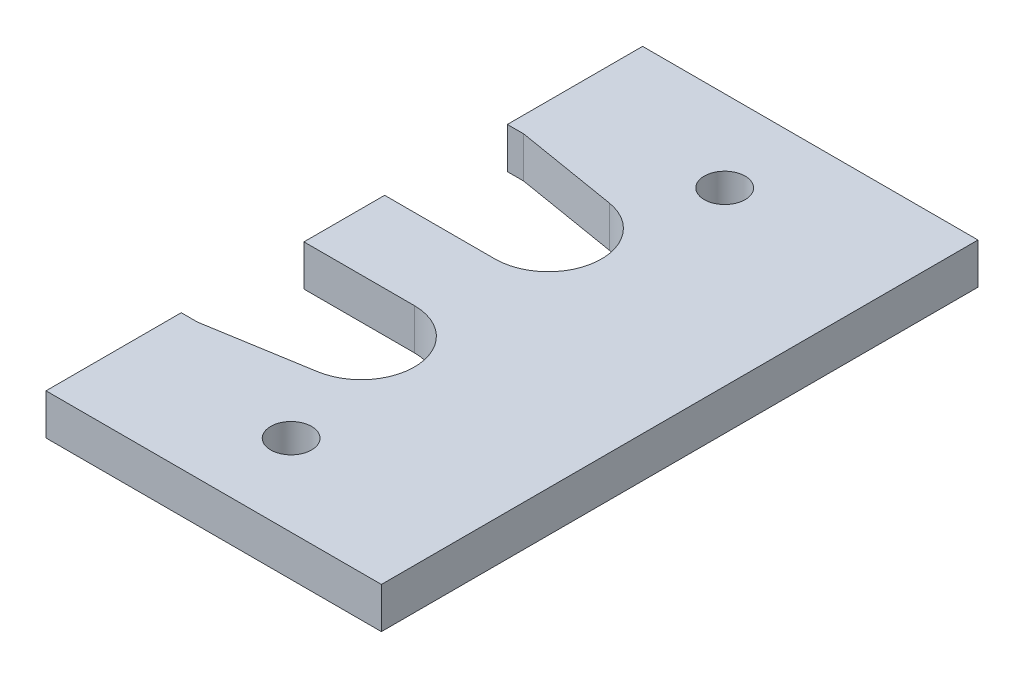
ISO-10303-21;
HEADER;
FILE_DESCRIPTION(('STEP AP214'),'2;1');
FILE_NAME('part.step','',(''),(''),'','','');
FILE_SCHEMA(('AUTOMOTIVE_DESIGN { 1 0 10303 214 1 1 1 1 }'));
ENDSEC;
DATA;
#1=APPLICATION_CONTEXT('core data for automotive mechanical design processes');
#2=APPLICATION_PROTOCOL_DEFINITION('international standard','automotive_design',2000,#1);
#3=PRODUCT_CONTEXT('',#1,'mechanical');
#4=PRODUCT('Part','Part','',(#3));
#5=PRODUCT_RELATED_PRODUCT_CATEGORY('part','',(#4));
#6=PRODUCT_DEFINITION_FORMATION('','',#4);
#7=PRODUCT_DEFINITION_CONTEXT('part definition',#1,'design');
#8=PRODUCT_DEFINITION('design','',#6,#7);
#9=PRODUCT_DEFINITION_SHAPE('','',#8);
#10=(LENGTH_UNIT() NAMED_UNIT(*) SI_UNIT(.MILLI.,.METRE.));
#11=(NAMED_UNIT(*) PLANE_ANGLE_UNIT() SI_UNIT($,.RADIAN.));
#12=(NAMED_UNIT(*) SI_UNIT($,.STERADIAN.) SOLID_ANGLE_UNIT());
#13=UNCERTAINTY_MEASURE_WITH_UNIT(LENGTH_MEASURE(1.E-05),#10,'distance_accuracy_value','');
#14=(GEOMETRIC_REPRESENTATION_CONTEXT(3) GLOBAL_UNCERTAINTY_ASSIGNED_CONTEXT((#13)) GLOBAL_UNIT_ASSIGNED_CONTEXT((#10,
#11,#12)) REPRESENTATION_CONTEXT('',''));
#15=CARTESIAN_POINT('',(0.,0.,0.));
#16=DIRECTION('',(0.,0.,1.));
#17=DIRECTION('',(1.,0.,0.));
#18=AXIS2_PLACEMENT_3D('',#15,#16,#17);
#19=CARTESIAN_POINT('',(8.20123472199718,5.,18.9136807914443));
#20=DIRECTION('',(0.,-1.,0.));
#21=DIRECTION('',(0.,0.,-1.));
#22=AXIS2_PLACEMENT_3D('',#19,#20,#21);
#23=PLANE('',#22);
#24=DIRECTION('',(-1.,0.,0.));
#25=VECTOR('',#24,1.);
#26=CARTESIAN_POINT('',(8.20123472199718,5.,2.55125735607543));
#27=LINE('',#26,#25);
#28=CARTESIAN_POINT('',(8.20123472199718,5.,2.55125735607543));
#29=VERTEX_POINT('',#28);
#30=CARTESIAN_POINT('',(-5.29876527800282,5.,2.55125735607543));
#31=VERTEX_POINT('',#30);
#32=EDGE_CURVE('E192',#29,#31,#27,.T.);
#33=ORIENTED_EDGE('',*,*,#32,.T.);
#34=DIRECTION('',(0.,0.,1.));
#35=VECTOR('',#34,1.);
#36=CARTESIAN_POINT('',(-5.29876527800282,5.,2.55125735607543));
#37=LINE('',#36,#35);
#38=CARTESIAN_POINT('',(-5.29876527800282,5.,12.4136807914443));
#39=VERTEX_POINT('',#38);
#40=EDGE_CURVE('E110',#31,#39,#37,.T.);
#41=ORIENTED_EDGE('',*,*,#40,.T.);
#42=DIRECTION('',(1.,0.,0.));
#43=VECTOR('',#42,1.);
#44=CARTESIAN_POINT('',(8.20123472199718,5.,12.4136807914443));
#45=LINE('',#44,#43);
#46=CARTESIAN_POINT('',(8.20123472199718,5.,12.4136807914443));
#47=VERTEX_POINT('',#46);
#48=EDGE_CURVE('E225',#39,#47,#45,.T.);
#49=ORIENTED_EDGE('',*,*,#48,.T.);
#50=CARTESIAN_POINT('',(8.20123472199718,5.,18.9136807914443));
#51=DIRECTION('',(0.,-1.,0.));
#52=DIRECTION('',(0.,0.,-1.));
#53=AXIS2_PLACEMENT_3D('',#50,#51,#52);
#54=CIRCLE('',#53,6.5);
#55=CARTESIAN_POINT('',(9.26668748951723,5.,25.3257639475008));
#56=VERTEX_POINT('',#55);
#57=EDGE_CURVE('E244',#47,#56,#54,.T.);
#58=ORIENTED_EDGE('',*,*,#57,.T.);
#59=DIRECTION('',(-0.986474331701005,0.,0.163915810387699));
#60=VECTOR('',#59,1.);
#61=CARTESIAN_POINT('',(-3.29876527800282,5.,27.4136807914443));
#62=LINE('',#61,#60);
#63=CARTESIAN_POINT('',(-3.29876527800282,5.,27.4136807914443));
#64=VERTEX_POINT('',#63);
#65=EDGE_CURVE('E241',#56,#64,#62,.T.);
#66=ORIENTED_EDGE('',*,*,#65,.T.);
#67=DIRECTION('',(-1.,0.,0.));
#68=VECTOR('',#67,1.);
#69=CARTESIAN_POINT('',(-5.29876527800282,5.,27.4136807914443));
#70=LINE('',#69,#68);
#71=CARTESIAN_POINT('',(-5.29876527800282,5.,27.4136807914443));
#72=VERTEX_POINT('',#71);
#73=EDGE_CURVE('E243',#64,#72,#70,.T.);
#74=ORIENTED_EDGE('',*,*,#73,.T.);
#75=DIRECTION('',(0.,0.,1.));
#76=VECTOR('',#75,1.);
#77=CARTESIAN_POINT('',(-5.29876527800282,5.,27.4136807914443));
#78=LINE('',#77,#76);
#79=CARTESIAN_POINT('',(-5.29876527800282,5.,43.9480749326021));
#80=VERTEX_POINT('',#79);
#81=EDGE_CURVE('E246',#72,#80,#78,.T.);
#82=ORIENTED_EDGE('',*,*,#81,.T.);
#83=DIRECTION('',(1.,0.,0.));
#84=VECTOR('',#83,1.);
#85=CARTESIAN_POINT('',(-5.29876527800282,5.,43.9480749326021));
#86=LINE('',#85,#84);
#87=CARTESIAN_POINT('',(35.7012347219972,5.,43.9480749326021));
#88=VERTEX_POINT('',#87);
#89=EDGE_CURVE('E252',#80,#88,#86,.T.);
#90=ORIENTED_EDGE('',*,*,#89,.T.);
#91=DIRECTION('',(0.,0.,-1.));
#92=VECTOR('',#91,1.);
#93=CARTESIAN_POINT('',(35.7012347219972,5.,-28.9831367850824));
#94=LINE('',#93,#92);
#95=CARTESIAN_POINT('',(35.7012347219972,5.,-28.9831367850824));
#96=VERTEX_POINT('',#95);
#97=EDGE_CURVE('E254',#88,#96,#94,.T.);
#98=ORIENTED_EDGE('',*,*,#97,.T.);
#99=DIRECTION('',(-1.,0.,0.));
#100=VECTOR('',#99,1.);
#101=CARTESIAN_POINT('',(-5.29876527800282,5.,-28.9831367850824));
#102=LINE('',#101,#100);
#103=CARTESIAN_POINT('',(-5.29876527800282,5.,-28.9831367850824));
#104=VERTEX_POINT('',#103);
#105=EDGE_CURVE('E256',#96,#104,#102,.T.);
#106=ORIENTED_EDGE('',*,*,#105,.T.);
#107=DIRECTION('',(0.,0.,1.));
#108=VECTOR('',#107,1.);
#109=CARTESIAN_POINT('',(-5.29876527800282,5.,-12.4487426439246));
#110=LINE('',#109,#108);
#111=CARTESIAN_POINT('',(-5.29876527800282,5.,-12.4487426439246));
#112=VERTEX_POINT('',#111);
#113=EDGE_CURVE('E147',#104,#112,#110,.T.);
#114=ORIENTED_EDGE('',*,*,#113,.T.);
#115=DIRECTION('',(1.,0.,0.));
#116=VECTOR('',#115,1.);
#117=CARTESIAN_POINT('',(-5.29876527800282,5.,-12.4487426439246));
#118=LINE('',#117,#116);
#119=CARTESIAN_POINT('',(-3.29876527800282,5.,-12.4487426439246));
#120=VERTEX_POINT('',#119);
#121=EDGE_CURVE('E141',#112,#120,#118,.T.);
#122=ORIENTED_EDGE('',*,*,#121,.T.);
#123=DIRECTION('',(0.986474331701005,0.,0.163915810387699));
#124=VECTOR('',#123,1.);
#125=CARTESIAN_POINT('',(-3.29876527800282,5.,-12.4487426439246));
#126=LINE('',#125,#124);
#127=CARTESIAN_POINT('',(9.26668748951723,5.,-10.3608257999811));
#128=VERTEX_POINT('',#127);
#129=EDGE_CURVE('E145',#120,#128,#126,.T.);
#130=ORIENTED_EDGE('',*,*,#129,.T.);
#131=CARTESIAN_POINT('',(8.20123472199718,5.,-3.94874264392457));
#132=DIRECTION('',(0.,-1.,0.));
#133=DIRECTION('',(0.,0.,1.));
#134=AXIS2_PLACEMENT_3D('',#131,#132,#133);
#135=CIRCLE('',#134,6.5);
#136=EDGE_CURVE('E49',#128,#29,#135,.T.);
#137=ORIENTED_EDGE('',*,*,#136,.T.);
#138=EDGE_LOOP('',(#33,#41,#49,#58,#66,#74,#82,#90,#98,#106,#114,#122,#130,#137));
#139=FACE_BOUND('',#138,.T.);
#140=CARTESIAN_POINT('',(14.7012347219972,5.,33.9824690737599));
#141=DIRECTION('',(0.,1.,0.));
#142=DIRECTION('',(0.,0.,-1.));
#143=AXIS2_PLACEMENT_3D('',#140,#141,#142);
#144=CIRCLE('',#143,2.5);
#145=CARTESIAN_POINT('',(14.7012347219972,5.,31.4824690737599));
#146=VERTEX_POINT('',#145);
#147=EDGE_CURVE('E169',#146,#146,#144,.T.);
#148=ORIENTED_EDGE('',*,*,#147,.F.);
#149=EDGE_LOOP('',(#148));
#150=FACE_BOUND('',#149,.T.);
#151=CARTESIAN_POINT('',(14.7012347219972,5.,-19.0175309262401));
#152=DIRECTION('',(0.,1.,0.));
#153=DIRECTION('',(0.,0.,1.));
#154=AXIS2_PLACEMENT_3D('',#151,#152,#153);
#155=CIRCLE('',#154,2.5);
#156=CARTESIAN_POINT('',(14.7012347219972,5.,-16.5175309262401));
#157=VERTEX_POINT('',#156);
#158=EDGE_CURVE('E297',#157,#157,#155,.T.);
#159=ORIENTED_EDGE('',*,*,#158,.F.);
#160=EDGE_LOOP('',(#159));
#161=FACE_BOUND('',#160,.T.);
#162=ADVANCED_FACE('F32',(#139,#150,#161),#23,.F.);
#163=CARTESIAN_POINT('',(8.20123472199718,0.,18.9136807914443));
#164=DIRECTION('',(0.,-1.,0.));
#165=DIRECTION('',(0.,0.,-1.));
#166=AXIS2_PLACEMENT_3D('',#163,#164,#165);
#167=PLANE('',#166);
#168=CARTESIAN_POINT('',(14.7012347219972,0.,33.9824690737599));
#169=DIRECTION('',(0.,1.,0.));
#170=DIRECTION('',(0.,0.,-1.));
#171=AXIS2_PLACEMENT_3D('',#168,#169,#170);
#172=CIRCLE('',#171,2.5);
#173=CARTESIAN_POINT('',(14.7012347219972,0.,31.4824690737599));
#174=VERTEX_POINT('',#173);
#175=EDGE_CURVE('E302',#174,#174,#172,.T.);
#176=ORIENTED_EDGE('',*,*,#175,.T.);
#177=EDGE_LOOP('',(#176));
#178=FACE_BOUND('',#177,.T.);
#179=DIRECTION('',(-1.,0.,0.));
#180=VECTOR('',#179,1.);
#181=CARTESIAN_POINT('',(8.20123472199718,0.,2.55125735607543));
#182=LINE('',#181,#180);
#183=CARTESIAN_POINT('',(8.20123472199718,0.,2.55125735607543));
#184=VERTEX_POINT('',#183);
#185=CARTESIAN_POINT('',(-5.29876527800282,0.,2.55125735607543));
#186=VERTEX_POINT('',#185);
#187=EDGE_CURVE('E165',#184,#186,#182,.T.);
#188=ORIENTED_EDGE('',*,*,#187,.F.);
#189=CARTESIAN_POINT('',(8.20123472199718,0.,-3.94874264392457));
#190=DIRECTION('',(0.,-1.,0.));
#191=DIRECTION('',(0.,0.,1.));
#192=AXIS2_PLACEMENT_3D('',#189,#190,#191);
#193=CIRCLE('',#192,6.5);
#194=CARTESIAN_POINT('',(9.26668748951723,0.,-10.3608257999811));
#195=VERTEX_POINT('',#194);
#196=EDGE_CURVE('E102',#195,#184,#193,.T.);
#197=ORIENTED_EDGE('',*,*,#196,.F.);
#198=DIRECTION('',(0.986474331701005,0.,0.163915810387699));
#199=VECTOR('',#198,1.);
#200=CARTESIAN_POINT('',(-3.29876527800282,0.,-12.4487426439246));
#201=LINE('',#200,#199);
#202=CARTESIAN_POINT('',(-3.29876527800282,0.,-12.4487426439246));
#203=VERTEX_POINT('',#202);
#204=EDGE_CURVE('E96',#203,#195,#201,.T.);
#205=ORIENTED_EDGE('',*,*,#204,.F.);
#206=DIRECTION('',(1.,0.,0.));
#207=VECTOR('',#206,1.);
#208=CARTESIAN_POINT('',(-5.29876527800282,0.,-12.4487426439246));
#209=LINE('',#208,#207);
#210=CARTESIAN_POINT('',(-5.29876527800282,0.,-12.4487426439246));
#211=VERTEX_POINT('',#210);
#212=EDGE_CURVE('E155',#211,#203,#209,.T.);
#213=ORIENTED_EDGE('',*,*,#212,.F.);
#214=DIRECTION('',(0.,0.,1.));
#215=VECTOR('',#214,1.);
#216=CARTESIAN_POINT('',(-5.29876527800282,0.,-12.4487426439246));
#217=LINE('',#216,#215);
#218=CARTESIAN_POINT('',(-5.29876527800282,0.,-28.9831367850824));
#219=VERTEX_POINT('',#218);
#220=EDGE_CURVE('E187',#219,#211,#217,.T.);
#221=ORIENTED_EDGE('',*,*,#220,.F.);
#222=DIRECTION('',(-1.,0.,0.));
#223=VECTOR('',#222,1.);
#224=CARTESIAN_POINT('',(-5.29876527800282,0.,-28.9831367850824));
#225=LINE('',#224,#223);
#226=CARTESIAN_POINT('',(35.7012347219972,0.,-28.9831367850824));
#227=VERTEX_POINT('',#226);
#228=EDGE_CURVE('E185',#227,#219,#225,.T.);
#229=ORIENTED_EDGE('',*,*,#228,.F.);
#230=DIRECTION('',(0.,0.,-1.));
#231=VECTOR('',#230,1.);
#232=CARTESIAN_POINT('',(35.7012347219972,0.,-28.9831367850824));
#233=LINE('',#232,#231);
#234=CARTESIAN_POINT('',(35.7012347219972,0.,43.9480749326021));
#235=VERTEX_POINT('',#234);
#236=EDGE_CURVE('E183',#235,#227,#233,.T.);
#237=ORIENTED_EDGE('',*,*,#236,.F.);
#238=DIRECTION('',(1.,0.,0.));
#239=VECTOR('',#238,1.);
#240=CARTESIAN_POINT('',(-5.29876527800282,0.,43.9480749326021));
#241=LINE('',#240,#239);
#242=CARTESIAN_POINT('',(-5.29876527800282,0.,43.9480749326021));
#243=VERTEX_POINT('',#242);
#244=EDGE_CURVE('E181',#243,#235,#241,.T.);
#245=ORIENTED_EDGE('',*,*,#244,.F.);
#246=DIRECTION('',(0.,0.,1.));
#247=VECTOR('',#246,1.);
#248=CARTESIAN_POINT('',(-5.29876527800282,0.,27.4136807914443));
#249=LINE('',#248,#247);
#250=CARTESIAN_POINT('',(-5.29876527800282,0.,27.4136807914443));
#251=VERTEX_POINT('',#250);
#252=EDGE_CURVE('E179',#251,#243,#249,.T.);
#253=ORIENTED_EDGE('',*,*,#252,.F.);
#254=DIRECTION('',(-1.,0.,0.));
#255=VECTOR('',#254,1.);
#256=CARTESIAN_POINT('',(-5.29876527800282,0.,27.4136807914443));
#257=LINE('',#256,#255);
#258=CARTESIAN_POINT('',(-3.29876527800282,0.,27.4136807914443));
#259=VERTEX_POINT('',#258);
#260=EDGE_CURVE('E177',#259,#251,#257,.T.);
#261=ORIENTED_EDGE('',*,*,#260,.F.);
#262=DIRECTION('',(-0.986474331701005,0.,0.163915810387699));
#263=VECTOR('',#262,1.);
#264=CARTESIAN_POINT('',(-3.29876527800282,0.,27.4136807914443));
#265=LINE('',#264,#263);
#266=CARTESIAN_POINT('',(9.26668748951723,0.,25.3257639475008));
#267=VERTEX_POINT('',#266);
#268=EDGE_CURVE('E175',#267,#259,#265,.T.);
#269=ORIENTED_EDGE('',*,*,#268,.F.);
#270=CARTESIAN_POINT('',(8.20123472199718,0.,18.9136807914443));
#271=DIRECTION('',(0.,-1.,0.));
#272=DIRECTION('',(0.,0.,-1.));
#273=AXIS2_PLACEMENT_3D('',#270,#271,#272);
#274=CIRCLE('',#273,6.5);
#275=CARTESIAN_POINT('',(8.20123472199718,0.,12.4136807914443));
#276=VERTEX_POINT('',#275);
#277=EDGE_CURVE('E173',#276,#267,#274,.T.);
#278=ORIENTED_EDGE('',*,*,#277,.F.);
#279=DIRECTION('',(1.,0.,0.));
#280=VECTOR('',#279,1.);
#281=CARTESIAN_POINT('',(8.20123472199718,0.,12.4136807914443));
#282=LINE('',#281,#280);
#283=CARTESIAN_POINT('',(-5.29876527800282,0.,12.4136807914443));
#284=VERTEX_POINT('',#283);
#285=EDGE_CURVE('E171',#284,#276,#282,.T.);
#286=ORIENTED_EDGE('',*,*,#285,.F.);
#287=DIRECTION('',(0.,0.,1.));
#288=VECTOR('',#287,1.);
#289=CARTESIAN_POINT('',(-5.29876527800282,0.,2.55125735607543));
#290=LINE('',#289,#288);
#291=EDGE_CURVE('E168',#186,#284,#290,.T.);
#292=ORIENTED_EDGE('',*,*,#291,.F.);
#293=EDGE_LOOP('',(#188,#197,#205,#213,#221,#229,#237,#245,#253,#261,#269,#278,#286,#292));
#294=FACE_BOUND('',#293,.T.);
#295=CARTESIAN_POINT('',(14.7012347219972,0.,-19.0175309262401));
#296=DIRECTION('',(0.,1.,0.));
#297=DIRECTION('',(0.,0.,1.));
#298=AXIS2_PLACEMENT_3D('',#295,#296,#297);
#299=CIRCLE('',#298,2.5);
#300=CARTESIAN_POINT('',(14.7012347219972,0.,-16.5175309262401));
#301=VERTEX_POINT('',#300);
#302=EDGE_CURVE('E300',#301,#301,#299,.T.);
#303=ORIENTED_EDGE('',*,*,#302,.T.);
#304=EDGE_LOOP('',(#303));
#305=FACE_BOUND('',#304,.T.);
#306=ADVANCED_FACE('F229',(#178,#294,#305),#167,.T.);
#307=CARTESIAN_POINT('',(8.20123472199718,5.,2.55125735607543));
#308=DIRECTION('',(0.,0.,1.));
#309=DIRECTION('',(1.,0.,0.));
#310=AXIS2_PLACEMENT_3D('',#307,#308,#309);
#311=PLANE('',#310);
#312=ORIENTED_EDGE('',*,*,#187,.T.);
#313=DIRECTION('',(0.,-1.,0.));
#314=VECTOR('',#313,1.);
#315=CARTESIAN_POINT('',(-5.29876527800282,5.,2.55125735607543));
#316=LINE('',#315,#314);
#317=EDGE_CURVE('E11',#31,#186,#316,.T.);
#318=ORIENTED_EDGE('',*,*,#317,.F.);
#319=ORIENTED_EDGE('',*,*,#32,.F.);
#320=DIRECTION('',(0.,-1.,0.));
#321=VECTOR('',#320,1.);
#322=CARTESIAN_POINT('',(8.20123472199718,5.,2.55125735607543));
#323=LINE('',#322,#321);
#324=EDGE_CURVE('E161',#29,#184,#323,.T.);
#325=ORIENTED_EDGE('',*,*,#324,.T.);
#326=EDGE_LOOP('',(#312,#318,#319,#325));
#327=FACE_BOUND('',#326,.T.);
#328=ADVANCED_FACE('F34',(#327),#311,.F.);
#329=CARTESIAN_POINT('',(-5.29876527800282,5.,2.55125735607543));
#330=DIRECTION('',(1.,0.,0.));
#331=DIRECTION('',(0.,0.,-1.));
#332=AXIS2_PLACEMENT_3D('',#329,#330,#331);
#333=PLANE('',#332);
#334=ORIENTED_EDGE('',*,*,#291,.T.);
#335=DIRECTION('',(0.,-1.,0.));
#336=VECTOR('',#335,1.);
#337=CARTESIAN_POINT('',(-5.29876527800282,5.,12.4136807914443));
#338=LINE('',#337,#336);
#339=EDGE_CURVE('E41',#39,#284,#338,.T.);
#340=ORIENTED_EDGE('',*,*,#339,.F.);
#341=ORIENTED_EDGE('',*,*,#40,.F.);
#342=ORIENTED_EDGE('',*,*,#317,.T.);
#343=EDGE_LOOP('',(#334,#340,#341,#342));
#344=FACE_BOUND('',#343,.T.);
#345=ADVANCED_FACE('F417',(#344),#333,.F.);
#346=CARTESIAN_POINT('',(8.20123472199718,5.,12.4136807914443));
#347=DIRECTION('',(0.,0.,-1.));
#348=DIRECTION('',(-1.,0.,0.));
#349=AXIS2_PLACEMENT_3D('',#346,#347,#348);
#350=PLANE('',#349);
#351=ORIENTED_EDGE('',*,*,#285,.T.);
#352=DIRECTION('',(0.,-1.,0.));
#353=VECTOR('',#352,1.);
#354=CARTESIAN_POINT('',(8.20123472199718,5.,12.4136807914443));
#355=LINE('',#354,#353);
#356=EDGE_CURVE('E217',#47,#276,#355,.T.);
#357=ORIENTED_EDGE('',*,*,#356,.F.);
#358=ORIENTED_EDGE('',*,*,#48,.F.);
#359=ORIENTED_EDGE('',*,*,#339,.T.);
#360=EDGE_LOOP('',(#351,#357,#358,#359));
#361=FACE_BOUND('',#360,.T.);
#362=ADVANCED_FACE('F223',(#361),#350,.F.);
#363=CARTESIAN_POINT('',(8.20123472199718,5.,18.9136807914443));
#364=DIRECTION('',(0.,-1.,0.));
#365=DIRECTION('',(0.,0.,-1.));
#366=AXIS2_PLACEMENT_3D('',#363,#364,#365);
#367=CYLINDRICAL_SURFACE('',#366,6.5);
#368=ORIENTED_EDGE('',*,*,#277,.T.);
#369=DIRECTION('',(0.,-1.,0.));
#370=VECTOR('',#369,1.);
#371=CARTESIAN_POINT('',(9.26668748951723,5.,25.3257639475008));
#372=LINE('',#371,#370);
#373=EDGE_CURVE('E214',#56,#267,#372,.T.);
#374=ORIENTED_EDGE('',*,*,#373,.F.);
#375=ORIENTED_EDGE('',*,*,#57,.F.);
#376=ORIENTED_EDGE('',*,*,#356,.T.);
#377=EDGE_LOOP('',(#368,#374,#375,#376));
#378=FACE_BOUND('',#377,.T.);
#379=ADVANCED_FACE('F235',(#378),#367,.F.);
#380=CARTESIAN_POINT('',(-3.29876527800282,5.,27.4136807914443));
#381=DIRECTION('',(0.163915810387699,0.,0.986474331701005));
#382=DIRECTION('',(0.986474331701005,0.,-0.163915810387699));
#383=AXIS2_PLACEMENT_3D('',#380,#381,#382);
#384=PLANE('',#383);
#385=ORIENTED_EDGE('',*,*,#268,.T.);
#386=DIRECTION('',(0.,-1.,0.));
#387=VECTOR('',#386,1.);
#388=CARTESIAN_POINT('',(-3.29876527800282,5.,27.4136807914443));
#389=LINE('',#388,#387);
#390=EDGE_CURVE('E211',#64,#259,#389,.T.);
#391=ORIENTED_EDGE('',*,*,#390,.F.);
#392=ORIENTED_EDGE('',*,*,#65,.F.);
#393=ORIENTED_EDGE('',*,*,#373,.T.);
#394=EDGE_LOOP('',(#385,#391,#392,#393));
#395=FACE_BOUND('',#394,.T.);
#396=ADVANCED_FACE('F239',(#395),#384,.F.);
#397=CARTESIAN_POINT('',(-5.29876527800282,5.,27.4136807914443));
#398=DIRECTION('',(0.,0.,1.));
#399=DIRECTION('',(1.,0.,0.));
#400=AXIS2_PLACEMENT_3D('',#397,#398,#399);
#401=PLANE('',#400);
#402=ORIENTED_EDGE('',*,*,#260,.T.);
#403=DIRECTION('',(0.,-1.,0.));
#404=VECTOR('',#403,1.);
#405=CARTESIAN_POINT('',(-5.29876527800282,5.,27.4136807914443));
#406=LINE('',#405,#404);
#407=EDGE_CURVE('E208',#72,#251,#406,.T.);
#408=ORIENTED_EDGE('',*,*,#407,.F.);
#409=ORIENTED_EDGE('',*,*,#73,.F.);
#410=ORIENTED_EDGE('',*,*,#390,.T.);
#411=EDGE_LOOP('',(#402,#408,#409,#410));
#412=FACE_BOUND('',#411,.T.);
#413=ADVANCED_FACE('F382',(#412),#401,.F.);
#414=CARTESIAN_POINT('',(-5.29876527800282,5.,27.4136807914443));
#415=DIRECTION('',(1.,0.,0.));
#416=DIRECTION('',(0.,0.,-1.));
#417=AXIS2_PLACEMENT_3D('',#414,#415,#416);
#418=PLANE('',#417);
#419=ORIENTED_EDGE('',*,*,#252,.T.);
#420=DIRECTION('',(0.,-1.,0.));
#421=VECTOR('',#420,1.);
#422=CARTESIAN_POINT('',(-5.29876527800282,5.,43.9480749326021));
#423=LINE('',#422,#421);
#424=EDGE_CURVE('E205',#80,#243,#423,.T.);
#425=ORIENTED_EDGE('',*,*,#424,.F.);
#426=ORIENTED_EDGE('',*,*,#81,.F.);
#427=ORIENTED_EDGE('',*,*,#407,.T.);
#428=EDGE_LOOP('',(#419,#425,#426,#427));
#429=FACE_BOUND('',#428,.T.);
#430=ADVANCED_FACE('F372',(#429),#418,.F.);
#431=CARTESIAN_POINT('',(-5.29876527800282,5.,43.9480749326021));
#432=DIRECTION('',(0.,0.,-1.));
#433=DIRECTION('',(-1.,0.,0.));
#434=AXIS2_PLACEMENT_3D('',#431,#432,#433);
#435=PLANE('',#434);
#436=ORIENTED_EDGE('',*,*,#244,.T.);
#437=DIRECTION('',(0.,-1.,0.));
#438=VECTOR('',#437,1.);
#439=CARTESIAN_POINT('',(35.7012347219972,5.,43.9480749326021));
#440=LINE('',#439,#438);
#441=EDGE_CURVE('E202',#88,#235,#440,.T.);
#442=ORIENTED_EDGE('',*,*,#441,.F.);
#443=ORIENTED_EDGE('',*,*,#89,.F.);
#444=ORIENTED_EDGE('',*,*,#424,.T.);
#445=EDGE_LOOP('',(#436,#442,#443,#444));
#446=FACE_BOUND('',#445,.T.);
#447=ADVANCED_FACE('F362',(#446),#435,.F.);
#448=CARTESIAN_POINT('',(35.7012347219972,5.,-28.9831367850824));
#449=DIRECTION('',(-1.,0.,0.));
#450=DIRECTION('',(0.,0.,1.));
#451=AXIS2_PLACEMENT_3D('',#448,#449,#450);
#452=PLANE('',#451);
#453=ORIENTED_EDGE('',*,*,#236,.T.);
#454=DIRECTION('',(0.,-1.,0.));
#455=VECTOR('',#454,1.);
#456=CARTESIAN_POINT('',(35.7012347219972,5.,-28.9831367850824));
#457=LINE('',#456,#455);
#458=EDGE_CURVE('E199',#96,#227,#457,.T.);
#459=ORIENTED_EDGE('',*,*,#458,.F.);
#460=ORIENTED_EDGE('',*,*,#97,.F.);
#461=ORIENTED_EDGE('',*,*,#441,.T.);
#462=EDGE_LOOP('',(#453,#459,#460,#461));
#463=FACE_BOUND('',#462,.T.);
#464=ADVANCED_FACE('F353',(#463),#452,.F.);
#465=CARTESIAN_POINT('',(-5.29876527800282,5.,-28.9831367850824));
#466=DIRECTION('',(0.,0.,1.));
#467=DIRECTION('',(1.,0.,0.));
#468=AXIS2_PLACEMENT_3D('',#465,#466,#467);
#469=PLANE('',#468);
#470=ORIENTED_EDGE('',*,*,#228,.T.);
#471=DIRECTION('',(0.,-1.,0.));
#472=VECTOR('',#471,1.);
#473=CARTESIAN_POINT('',(-5.29876527800282,5.,-28.9831367850824));
#474=LINE('',#473,#472);
#475=EDGE_CURVE('E196',#104,#219,#474,.T.);
#476=ORIENTED_EDGE('',*,*,#475,.F.);
#477=ORIENTED_EDGE('',*,*,#105,.F.);
#478=ORIENTED_EDGE('',*,*,#458,.T.);
#479=EDGE_LOOP('',(#470,#476,#477,#478));
#480=FACE_BOUND('',#479,.T.);
#481=ADVANCED_FACE('F262',(#480),#469,.F.);
#482=CARTESIAN_POINT('',(-5.29876527800282,5.,-12.4487426439246));
#483=DIRECTION('',(1.,0.,0.));
#484=DIRECTION('',(0.,0.,-1.));
#485=AXIS2_PLACEMENT_3D('',#482,#483,#484);
#486=PLANE('',#485);
#487=ORIENTED_EDGE('',*,*,#220,.T.);
#488=DIRECTION('',(0.,-1.,0.));
#489=VECTOR('',#488,1.);
#490=CARTESIAN_POINT('',(-5.29876527800282,5.,-12.4487426439246));
#491=LINE('',#490,#489);
#492=EDGE_CURVE('E156',#112,#211,#491,.T.);
#493=ORIENTED_EDGE('',*,*,#492,.F.);
#494=ORIENTED_EDGE('',*,*,#113,.F.);
#495=ORIENTED_EDGE('',*,*,#475,.T.);
#496=EDGE_LOOP('',(#487,#493,#494,#495));
#497=FACE_BOUND('',#496,.T.);
#498=ADVANCED_FACE('F266',(#497),#486,.F.);
#499=CARTESIAN_POINT('',(-5.29876527800282,5.,-12.4487426439246));
#500=DIRECTION('',(0.,0.,-1.));
#501=DIRECTION('',(-1.,0.,0.));
#502=AXIS2_PLACEMENT_3D('',#499,#500,#501);
#503=PLANE('',#502);
#504=ORIENTED_EDGE('',*,*,#212,.T.);
#505=DIRECTION('',(0.,-1.,0.));
#506=VECTOR('',#505,1.);
#507=CARTESIAN_POINT('',(-3.29876527800282,5.,-12.4487426439246));
#508=LINE('',#507,#506);
#509=EDGE_CURVE('E152',#120,#203,#508,.T.);
#510=ORIENTED_EDGE('',*,*,#509,.F.);
#511=ORIENTED_EDGE('',*,*,#121,.F.);
#512=ORIENTED_EDGE('',*,*,#492,.T.);
#513=EDGE_LOOP('',(#504,#510,#511,#512));
#514=FACE_BOUND('',#513,.T.);
#515=ADVANCED_FACE('F153',(#514),#503,.F.);
#516=CARTESIAN_POINT('',(-3.29876527800282,5.,-12.4487426439246));
#517=DIRECTION('',(0.163915810387699,0.,-0.986474331701005));
#518=DIRECTION('',(-0.986474331701005,0.,-0.163915810387699));
#519=AXIS2_PLACEMENT_3D('',#516,#517,#518);
#520=PLANE('',#519);
#521=ORIENTED_EDGE('',*,*,#204,.T.);
#522=DIRECTION('',(0.,-1.,0.));
#523=VECTOR('',#522,1.);
#524=CARTESIAN_POINT('',(9.26668748951723,5.,-10.3608257999811));
#525=LINE('',#524,#523);
#526=EDGE_CURVE('E157',#128,#195,#525,.T.);
#527=ORIENTED_EDGE('',*,*,#526,.F.);
#528=ORIENTED_EDGE('',*,*,#129,.F.);
#529=ORIENTED_EDGE('',*,*,#509,.T.);
#530=EDGE_LOOP('',(#521,#527,#528,#529));
#531=FACE_BOUND('',#530,.T.);
#532=ADVANCED_FACE('F159',(#531),#520,.F.);
#533=CARTESIAN_POINT('',(8.20123472199718,5.,-3.94874264392457));
#534=DIRECTION('',(0.,-1.,0.));
#535=DIRECTION('',(0.,0.,-1.));
#536=AXIS2_PLACEMENT_3D('',#533,#534,#535);
#537=CYLINDRICAL_SURFACE('',#536,6.5);
#538=ORIENTED_EDGE('',*,*,#196,.T.);
#539=ORIENTED_EDGE('',*,*,#324,.F.);
#540=ORIENTED_EDGE('',*,*,#136,.F.);
#541=ORIENTED_EDGE('',*,*,#526,.T.);
#542=EDGE_LOOP('',(#538,#539,#540,#541));
#543=FACE_BOUND('',#542,.T.);
#544=ADVANCED_FACE('F270',(#543),#537,.F.);
#545=CARTESIAN_POINT('',(14.7012347219972,5.,33.9824690737599));
#546=DIRECTION('',(0.,-1.,0.));
#547=DIRECTION('',(0.,0.,-1.));
#548=AXIS2_PLACEMENT_3D('',#545,#546,#547);
#549=CYLINDRICAL_SURFACE('',#548,2.5);
#550=ORIENTED_EDGE('',*,*,#147,.T.);
#551=EDGE_LOOP('',(#550));
#552=FACE_BOUND('',#551,.T.);
#553=ORIENTED_EDGE('',*,*,#175,.F.);
#554=EDGE_LOOP('',(#553));
#555=FACE_BOUND('',#554,.T.);
#556=ADVANCED_FACE('F272',(#552,#555),#549,.F.);
#557=CARTESIAN_POINT('',(14.7012347219972,5.,-19.0175309262401));
#558=DIRECTION('',(0.,-1.,0.));
#559=DIRECTION('',(0.,0.,-1.));
#560=AXIS2_PLACEMENT_3D('',#557,#558,#559);
#561=CYLINDRICAL_SURFACE('',#560,2.5);
#562=ORIENTED_EDGE('',*,*,#158,.T.);
#563=EDGE_LOOP('',(#562));
#564=FACE_BOUND('',#563,.T.);
#565=ORIENTED_EDGE('',*,*,#302,.F.);
#566=EDGE_LOOP('',(#565));
#567=FACE_BOUND('',#566,.T.);
#568=ADVANCED_FACE('F278',(#564,#567),#561,.F.);
#569=CLOSED_SHELL('',(#162,#306,#328,#345,#362,#379,#396,#413,#430,#447,#464,#481,#498,#515,
#532,#544,#556,#568));
#570=MANIFOLD_SOLID_BREP('B2',#569);
#571=ADVANCED_BREP_SHAPE_REPRESENTATION('',(#18,#570),#14);
#572=SHAPE_DEFINITION_REPRESENTATION(#9,#571);
ENDSEC;
END-ISO-10303-21;
